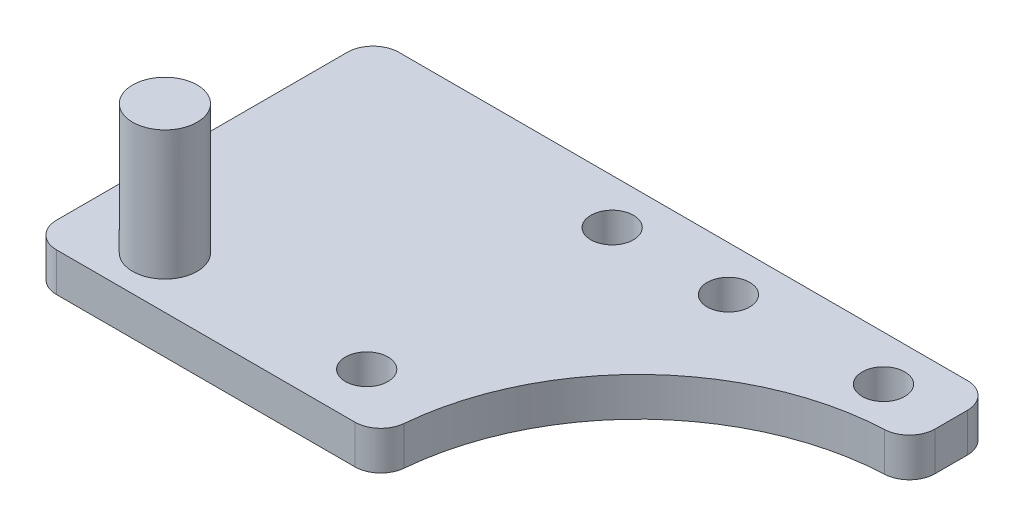
ISO-10303-21;
HEADER;
FILE_DESCRIPTION(('STEP AP214'),'2;1');
FILE_NAME('part.step','',(''),(''),'','','');
FILE_SCHEMA(('AUTOMOTIVE_DESIGN { 1 0 10303 214 1 1 1 1 }'));
ENDSEC;
DATA;
#1=APPLICATION_CONTEXT('core data for automotive mechanical design processes');
#2=APPLICATION_PROTOCOL_DEFINITION('international standard','automotive_design',2000,#1);
#3=PRODUCT_CONTEXT('',#1,'mechanical');
#4=PRODUCT('Part','Part','',(#3));
#5=PRODUCT_RELATED_PRODUCT_CATEGORY('part','',(#4));
#6=PRODUCT_DEFINITION_FORMATION('','',#4);
#7=PRODUCT_DEFINITION_CONTEXT('part definition',#1,'design');
#8=PRODUCT_DEFINITION('design','',#6,#7);
#9=PRODUCT_DEFINITION_SHAPE('','',#8);
#10=(LENGTH_UNIT() NAMED_UNIT(*) SI_UNIT(.MILLI.,.METRE.));
#11=(NAMED_UNIT(*) PLANE_ANGLE_UNIT() SI_UNIT($,.RADIAN.));
#12=(NAMED_UNIT(*) SI_UNIT($,.STERADIAN.) SOLID_ANGLE_UNIT());
#13=UNCERTAINTY_MEASURE_WITH_UNIT(LENGTH_MEASURE(1.E-05),#10,'distance_accuracy_value','');
#14=(GEOMETRIC_REPRESENTATION_CONTEXT(3) GLOBAL_UNCERTAINTY_ASSIGNED_CONTEXT((#13)) GLOBAL_UNIT_ASSIGNED_CONTEXT((#10,
#11,#12)) REPRESENTATION_CONTEXT('',''));
#15=CARTESIAN_POINT('',(0.,0.,0.));
#16=DIRECTION('',(0.,0.,1.));
#17=DIRECTION('',(1.,0.,0.));
#18=AXIS2_PLACEMENT_3D('',#15,#16,#17);
#19=CARTESIAN_POINT('',(55.9999843544523,3.,3.97498357217662));
#20=DIRECTION('',(0.,-1.,0.));
#21=DIRECTION('',(0.,0.,-1.));
#22=AXIS2_PLACEMENT_3D('',#19,#20,#21);
#23=PLANE('',#22);
#24=CARTESIAN_POINT('',(15.3807465805084,3.,0.));
#25=DIRECTION('',(0.,-1.,0.));
#26=DIRECTION('',(0.,0.,-1.));
#27=AXIS2_PLACEMENT_3D('',#24,#25,#26);
#28=CIRCLE('',#27,2.5);
#29=CARTESIAN_POINT('',(15.3807465805084,3.,-2.5));
#30=VERTEX_POINT('',#29);
#31=EDGE_CURVE('E152',#30,#30,#28,.F.);
#32=ORIENTED_EDGE('',*,*,#31,.F.);
#33=EDGE_LOOP('',(#32));
#34=FACE_BOUND('',#33,.T.);
#35=DIRECTION('',(0.,0.,-1.));
#36=VECTOR('',#35,1.);
#37=CARTESIAN_POINT('',(57.,3.,-20.9999999999984));
#38=LINE('',#37,#36);
#39=CARTESIAN_POINT('',(57.,3.,-18.0022781155508));
#40=VERTEX_POINT('',#39);
#41=CARTESIAN_POINT('',(57.,3.,-20.4937058414741));
#42=VERTEX_POINT('',#41);
#43=EDGE_CURVE('E155',#40,#42,#38,.T.);
#44=ORIENTED_EDGE('',*,*,#43,.T.);
#45=CARTESIAN_POINT('',(55.,3.,-20.4937058414741));
#46=DIRECTION('',(0.,-1.,0.));
#47=DIRECTION('',(0.,0.,-1.));
#48=AXIS2_PLACEMENT_3D('',#45,#46,#47);
#49=CIRCLE('',#48,2.);
#50=CARTESIAN_POINT('',(55.,3.,-22.4937058414741));
#51=VERTEX_POINT('',#50);
#52=EDGE_CURVE('E173',#42,#51,#49,.F.);
#53=ORIENTED_EDGE('',*,*,#52,.T.);
#54=DIRECTION('',(-1.,0.,0.));
#55=VECTOR('',#54,1.);
#56=CARTESIAN_POINT('',(8.99999999999998,3.,-22.4937058414741));
#57=LINE('',#56,#55);
#58=CARTESIAN_POINT('',(11.,3.,-22.4937058414741));
#59=VERTEX_POINT('',#58);
#60=EDGE_CURVE('E137',#51,#59,#57,.T.);
#61=ORIENTED_EDGE('',*,*,#60,.T.);
#62=CARTESIAN_POINT('',(11.,3.,-20.4937058414741));
#63=DIRECTION('',(0.,-1.,0.));
#64=DIRECTION('',(0.,0.,-1.));
#65=AXIS2_PLACEMENT_3D('',#62,#63,#64);
#66=CIRCLE('',#65,2.);
#67=CARTESIAN_POINT('',(8.99999999999998,3.,-20.4937058414741));
#68=VERTEX_POINT('',#67);
#69=EDGE_CURVE('E166',#59,#68,#66,.F.);
#70=ORIENTED_EDGE('',*,*,#69,.T.);
#71=DIRECTION('',(0.,0.,1.));
#72=VECTOR('',#71,1.);
#73=CARTESIAN_POINT('',(8.99999999999998,3.,4.));
#74=LINE('',#73,#72);
#75=CARTESIAN_POINT('',(8.99999999999998,3.,2.));
#76=VERTEX_POINT('',#75);
#77=EDGE_CURVE('E146',#68,#76,#74,.T.);
#78=ORIENTED_EDGE('',*,*,#77,.T.);
#79=CARTESIAN_POINT('',(11.,3.,2.));
#80=DIRECTION('',(0.,-1.,0.));
#81=DIRECTION('',(0.,0.,-1.));
#82=AXIS2_PLACEMENT_3D('',#79,#80,#81);
#83=CIRCLE('',#82,2.);
#84=CARTESIAN_POINT('',(11.,3.,4.));
#85=VERTEX_POINT('',#84);
#86=EDGE_CURVE('E168',#76,#85,#83,.F.);
#87=ORIENTED_EDGE('',*,*,#86,.T.);
#88=DIRECTION('',(1.,0.,0.));
#89=VECTOR('',#88,1.);
#90=CARTESIAN_POINT('',(8.99999999999998,3.,4.));
#91=LINE('',#90,#89);
#92=CARTESIAN_POINT('',(34.088812777158,3.,4.));
#93=VERTEX_POINT('',#92);
#94=EDGE_CURVE('E218',#85,#93,#91,.T.);
#95=ORIENTED_EDGE('',*,*,#94,.T.);
#96=CARTESIAN_POINT('',(34.088812777158,3.,2.));
#97=DIRECTION('',(0.,-1.,0.));
#98=DIRECTION('',(0.,0.,-1.));
#99=AXIS2_PLACEMENT_3D('',#96,#97,#98);
#100=CIRCLE('',#99,2.);
#101=CARTESIAN_POINT('',(36.0807374660029,3.,2.17954396110697));
#102=VERTEX_POINT('',#101);
#103=EDGE_CURVE('E61',#93,#102,#100,.F.);
#104=ORIENTED_EDGE('',*,*,#103,.T.);
#105=CARTESIAN_POINT('',(55.9999843544523,3.,3.97498357217662));
#106=DIRECTION('',(0.,-1.,0.));
#107=DIRECTION('',(0.,0.,-1.));
#108=AXIS2_PLACEMENT_3D('',#105,#106,#107);
#109=CIRCLE('',#108,20.);
#110=CARTESIAN_POINT('',(55.0909076685865,3.,-16.0043452348483));
#111=VERTEX_POINT('',#110);
#112=EDGE_CURVE('E215',#102,#111,#109,.T.);
#113=ORIENTED_EDGE('',*,*,#112,.T.);
#114=CARTESIAN_POINT('',(55.,3.,-18.0022781155508));
#115=DIRECTION('',(0.,-1.,0.));
#116=DIRECTION('',(0.,0.,-1.));
#117=AXIS2_PLACEMENT_3D('',#114,#115,#116);
#118=CIRCLE('',#117,2.);
#119=EDGE_CURVE('E171',#111,#40,#118,.F.);
#120=ORIENTED_EDGE('',*,*,#119,.T.);
#121=EDGE_LOOP('',(#44,#53,#61,#70,#78,#87,#95,#104,#113,#120));
#122=FACE_BOUND('',#121,.T.);
#123=CARTESIAN_POINT('',(31.,3.,-19.));
#124=DIRECTION('',(0.,1.,0.));
#125=DIRECTION('',(0.,0.,1.));
#126=AXIS2_PLACEMENT_3D('',#123,#124,#125);
#127=CIRCLE('',#126,1.65);
#128=CARTESIAN_POINT('',(31.,3.,-17.35));
#129=VERTEX_POINT('',#128);
#130=EDGE_CURVE('E196',#129,#129,#127,.T.);
#131=ORIENTED_EDGE('',*,*,#130,.F.);
#132=EDGE_LOOP('',(#131));
#133=FACE_BOUND('',#132,.T.);
#134=CARTESIAN_POINT('',(40.,3.,-19.));
#135=DIRECTION('',(0.,1.,0.));
#136=DIRECTION('',(0.,0.,1.));
#137=AXIS2_PLACEMENT_3D('',#134,#135,#136);
#138=CIRCLE('',#137,1.65);
#139=CARTESIAN_POINT('',(40.,3.,-17.35));
#140=VERTEX_POINT('',#139);
#141=EDGE_CURVE('E223',#140,#140,#138,.T.);
#142=ORIENTED_EDGE('',*,*,#141,.F.);
#143=EDGE_LOOP('',(#142));
#144=FACE_BOUND('',#143,.T.);
#145=CARTESIAN_POINT('',(52.,3.,-19.));
#146=DIRECTION('',(0.,1.,0.));
#147=DIRECTION('',(0.,0.,1.));
#148=AXIS2_PLACEMENT_3D('',#145,#146,#147);
#149=CIRCLE('',#148,1.65);
#150=CARTESIAN_POINT('',(52.,3.,-17.35));
#151=VERTEX_POINT('',#150);
#152=EDGE_CURVE('E228',#151,#151,#149,.T.);
#153=ORIENTED_EDGE('',*,*,#152,.F.);
#154=EDGE_LOOP('',(#153));
#155=FACE_BOUND('',#154,.T.);
#156=CARTESIAN_POINT('',(31.,3.,0.));
#157=DIRECTION('',(0.,1.,0.));
#158=DIRECTION('',(0.,0.,1.));
#159=AXIS2_PLACEMENT_3D('',#156,#157,#158);
#160=CIRCLE('',#159,1.65);
#161=CARTESIAN_POINT('',(31.,3.,1.65));
#162=VERTEX_POINT('',#161);
#163=EDGE_CURVE('E234',#162,#162,#160,.T.);
#164=ORIENTED_EDGE('',*,*,#163,.F.);
#165=EDGE_LOOP('',(#164));
#166=FACE_BOUND('',#165,.T.);
#167=ADVANCED_FACE('F39',(#34,#122,#133,#144,#155,#166),#23,.F.);
#168=CARTESIAN_POINT('',(55.9999843544523,0.,3.97498357217662));
#169=DIRECTION('',(0.,-1.,0.));
#170=DIRECTION('',(0.,0.,-1.));
#171=AXIS2_PLACEMENT_3D('',#168,#169,#170);
#172=PLANE('',#171);
#173=CARTESIAN_POINT('',(52.,0.,-19.));
#174=DIRECTION('',(0.,1.,0.));
#175=DIRECTION('',(0.,0.,1.));
#176=AXIS2_PLACEMENT_3D('',#173,#174,#175);
#177=CIRCLE('',#176,1.65);
#178=CARTESIAN_POINT('',(52.,0.,-17.35));
#179=VERTEX_POINT('',#178);
#180=EDGE_CURVE('E231',#179,#179,#177,.T.);
#181=ORIENTED_EDGE('',*,*,#180,.T.);
#182=EDGE_LOOP('',(#181));
#183=FACE_BOUND('',#182,.T.);
#184=CARTESIAN_POINT('',(31.,0.,-19.));
#185=DIRECTION('',(0.,1.,0.));
#186=DIRECTION('',(0.,0.,1.));
#187=AXIS2_PLACEMENT_3D('',#184,#185,#186);
#188=CIRCLE('',#187,1.65);
#189=CARTESIAN_POINT('',(31.,0.,-17.35));
#190=VERTEX_POINT('',#189);
#191=EDGE_CURVE('E201',#190,#190,#188,.T.);
#192=ORIENTED_EDGE('',*,*,#191,.T.);
#193=EDGE_LOOP('',(#192));
#194=FACE_BOUND('',#193,.T.);
#195=DIRECTION('',(-1.,0.,0.));
#196=VECTOR('',#195,1.);
#197=CARTESIAN_POINT('',(21.,0.,-22.4937058414741));
#198=LINE('',#197,#196);
#199=CARTESIAN_POINT('',(55.,0.,-22.4937058414741));
#200=VERTEX_POINT('',#199);
#201=CARTESIAN_POINT('',(11.,0.,-22.4937058414741));
#202=VERTEX_POINT('',#201);
#203=EDGE_CURVE('E134',#200,#202,#198,.T.);
#204=ORIENTED_EDGE('',*,*,#203,.F.);
#205=CARTESIAN_POINT('',(55.,0.,-20.4937058414741));
#206=DIRECTION('',(0.,-1.,0.));
#207=DIRECTION('',(0.,0.,-1.));
#208=AXIS2_PLACEMENT_3D('',#205,#206,#207);
#209=CIRCLE('',#208,2.);
#210=CARTESIAN_POINT('',(57.,0.,-20.4937058414741));
#211=VERTEX_POINT('',#210);
#212=EDGE_CURVE('E117',#200,#211,#209,.T.);
#213=ORIENTED_EDGE('',*,*,#212,.T.);
#214=DIRECTION('',(0.,0.,-1.));
#215=VECTOR('',#214,1.);
#216=CARTESIAN_POINT('',(57.,0.,-22.4937058414741));
#217=LINE('',#216,#215);
#218=CARTESIAN_POINT('',(57.,0.,-18.0022781155508));
#219=VERTEX_POINT('',#218);
#220=EDGE_CURVE('E144',#219,#211,#217,.T.);
#221=ORIENTED_EDGE('',*,*,#220,.F.);
#222=CARTESIAN_POINT('',(55.,0.,-18.0022781155508));
#223=DIRECTION('',(0.,-1.,0.));
#224=DIRECTION('',(0.,0.,-1.));
#225=AXIS2_PLACEMENT_3D('',#222,#223,#224);
#226=CIRCLE('',#225,2.);
#227=CARTESIAN_POINT('',(55.0909076685865,0.,-16.0043452348483));
#228=VERTEX_POINT('',#227);
#229=EDGE_CURVE('E128',#219,#228,#226,.T.);
#230=ORIENTED_EDGE('',*,*,#229,.T.);
#231=CARTESIAN_POINT('',(55.9999843544523,0.,3.97498357217662));
#232=DIRECTION('',(0.,-1.,0.));
#233=DIRECTION('',(0.,0.,-1.));
#234=AXIS2_PLACEMENT_3D('',#231,#232,#233);
#235=CIRCLE('',#234,20.);
#236=CARTESIAN_POINT('',(36.0807374660029,0.,2.17954396110697));
#237=VERTEX_POINT('',#236);
#238=EDGE_CURVE('E148',#237,#228,#235,.T.);
#239=ORIENTED_EDGE('',*,*,#238,.F.);
#240=CARTESIAN_POINT('',(34.088812777158,0.,2.));
#241=DIRECTION('',(0.,-1.,0.));
#242=DIRECTION('',(0.,0.,-1.));
#243=AXIS2_PLACEMENT_3D('',#240,#241,#242);
#244=CIRCLE('',#243,2.);
#245=CARTESIAN_POINT('',(34.088812777158,0.,4.));
#246=VERTEX_POINT('',#245);
#247=EDGE_CURVE('E160',#237,#246,#244,.T.);
#248=ORIENTED_EDGE('',*,*,#247,.T.);
#249=DIRECTION('',(1.,0.,0.));
#250=VECTOR('',#249,1.);
#251=CARTESIAN_POINT('',(8.99999999999998,0.,4.));
#252=LINE('',#251,#250);
#253=CARTESIAN_POINT('',(11.,0.,4.));
#254=VERTEX_POINT('',#253);
#255=EDGE_CURVE('E195',#254,#246,#252,.T.);
#256=ORIENTED_EDGE('',*,*,#255,.F.);
#257=CARTESIAN_POINT('',(11.,0.,2.));
#258=DIRECTION('',(0.,-1.,0.));
#259=DIRECTION('',(0.,0.,-1.));
#260=AXIS2_PLACEMENT_3D('',#257,#258,#259);
#261=CIRCLE('',#260,2.);
#262=CARTESIAN_POINT('',(8.99999999999998,0.,2.));
#263=VERTEX_POINT('',#262);
#264=EDGE_CURVE('E158',#254,#263,#261,.T.);
#265=ORIENTED_EDGE('',*,*,#264,.T.);
#266=DIRECTION('',(0.,0.,1.));
#267=VECTOR('',#266,1.);
#268=CARTESIAN_POINT('',(8.99999999999998,0.,4.));
#269=LINE('',#268,#267);
#270=CARTESIAN_POINT('',(8.99999999999998,0.,-20.4937058414741));
#271=VERTEX_POINT('',#270);
#272=EDGE_CURVE('E189',#271,#263,#269,.T.);
#273=ORIENTED_EDGE('',*,*,#272,.F.);
#274=CARTESIAN_POINT('',(11.,0.,-20.4937058414741));
#275=DIRECTION('',(0.,-1.,0.));
#276=DIRECTION('',(0.,0.,-1.));
#277=AXIS2_PLACEMENT_3D('',#274,#275,#276);
#278=CIRCLE('',#277,2.);
#279=EDGE_CURVE('E138',#271,#202,#278,.T.);
#280=ORIENTED_EDGE('',*,*,#279,.T.);
#281=EDGE_LOOP('',(#204,#213,#221,#230,#239,#248,#256,#265,#273,#280));
#282=FACE_BOUND('',#281,.T.);
#283=CARTESIAN_POINT('',(40.,0.,-19.));
#284=DIRECTION('',(0.,1.,0.));
#285=DIRECTION('',(0.,0.,1.));
#286=AXIS2_PLACEMENT_3D('',#283,#284,#285);
#287=CIRCLE('',#286,1.65);
#288=CARTESIAN_POINT('',(40.,0.,-17.35));
#289=VERTEX_POINT('',#288);
#290=EDGE_CURVE('E225',#289,#289,#287,.T.);
#291=ORIENTED_EDGE('',*,*,#290,.T.);
#292=EDGE_LOOP('',(#291));
#293=FACE_BOUND('',#292,.T.);
#294=CARTESIAN_POINT('',(31.,0.,0.));
#295=DIRECTION('',(0.,1.,0.));
#296=DIRECTION('',(0.,0.,1.));
#297=AXIS2_PLACEMENT_3D('',#294,#295,#296);
#298=CIRCLE('',#297,1.65);
#299=CARTESIAN_POINT('',(31.,0.,1.65));
#300=VERTEX_POINT('',#299);
#301=EDGE_CURVE('E237',#300,#300,#298,.T.);
#302=ORIENTED_EDGE('',*,*,#301,.T.);
#303=EDGE_LOOP('',(#302));
#304=FACE_BOUND('',#303,.T.);
#305=ADVANCED_FACE('F141',(#183,#194,#282,#293,#304),#172,.T.);
#306=CARTESIAN_POINT('',(8.99999999999998,3.,4.));
#307=DIRECTION('',(1.,0.,0.));
#308=DIRECTION('',(0.,0.,-1.));
#309=AXIS2_PLACEMENT_3D('',#306,#307,#308);
#310=PLANE('',#309);
#311=ORIENTED_EDGE('',*,*,#272,.T.);
#312=DIRECTION('',(0.,-1.,0.));
#313=VECTOR('',#312,1.);
#314=CARTESIAN_POINT('',(8.99999999999998,3.,2.));
#315=LINE('',#314,#313);
#316=EDGE_CURVE('E11',#263,#76,#315,.F.);
#317=ORIENTED_EDGE('',*,*,#316,.T.);
#318=ORIENTED_EDGE('',*,*,#77,.F.);
#319=DIRECTION('',(0.,-1.,0.));
#320=VECTOR('',#319,1.);
#321=CARTESIAN_POINT('',(8.99999999999998,3.,-20.4937058414741));
#322=LINE('',#321,#320);
#323=EDGE_CURVE('E47',#68,#271,#322,.T.);
#324=ORIENTED_EDGE('',*,*,#323,.T.);
#325=EDGE_LOOP('',(#311,#317,#318,#324));
#326=FACE_BOUND('',#325,.T.);
#327=ADVANCED_FACE('F188',(#326),#310,.F.);
#328=CARTESIAN_POINT('',(8.99999999999998,3.,4.));
#329=DIRECTION('',(0.,0.,-1.));
#330=DIRECTION('',(-1.,0.,0.));
#331=AXIS2_PLACEMENT_3D('',#328,#329,#330);
#332=PLANE('',#331);
#333=ORIENTED_EDGE('',*,*,#255,.T.);
#334=DIRECTION('',(0.,-1.,0.));
#335=VECTOR('',#334,1.);
#336=CARTESIAN_POINT('',(34.088812777158,3.,4.));
#337=LINE('',#336,#335);
#338=EDGE_CURVE('E182',#246,#93,#337,.F.);
#339=ORIENTED_EDGE('',*,*,#338,.T.);
#340=ORIENTED_EDGE('',*,*,#94,.F.);
#341=DIRECTION('',(0.,-1.,0.));
#342=VECTOR('',#341,1.);
#343=CARTESIAN_POINT('',(11.,3.,4.));
#344=LINE('',#343,#342);
#345=EDGE_CURVE('E179',#85,#254,#344,.T.);
#346=ORIENTED_EDGE('',*,*,#345,.T.);
#347=EDGE_LOOP('',(#333,#339,#340,#346));
#348=FACE_BOUND('',#347,.T.);
#349=ADVANCED_FACE('F273',(#348),#332,.F.);
#350=CARTESIAN_POINT('',(55.9999843544523,3.,3.97498357217662));
#351=DIRECTION('',(0.,-1.,0.));
#352=DIRECTION('',(0.,0.,-1.));
#353=AXIS2_PLACEMENT_3D('',#350,#351,#352);
#354=CYLINDRICAL_SURFACE('',#353,20.);
#355=ORIENTED_EDGE('',*,*,#238,.T.);
#356=DIRECTION('',(0.,-1.,0.));
#357=VECTOR('',#356,1.);
#358=CARTESIAN_POINT('',(55.0909076685865,3.,-16.0043452348483));
#359=LINE('',#358,#357);
#360=EDGE_CURVE('E54',#228,#111,#359,.F.);
#361=ORIENTED_EDGE('',*,*,#360,.T.);
#362=ORIENTED_EDGE('',*,*,#112,.F.);
#363=DIRECTION('',(0.,-1.,0.));
#364=VECTOR('',#363,1.);
#365=CARTESIAN_POINT('',(36.0807374660029,3.,2.17954396110697));
#366=LINE('',#365,#364);
#367=EDGE_CURVE('E175',#102,#237,#366,.T.);
#368=ORIENTED_EDGE('',*,*,#367,.T.);
#369=EDGE_LOOP('',(#355,#361,#362,#368));
#370=FACE_BOUND('',#369,.T.);
#371=ADVANCED_FACE('F206',(#370),#354,.F.);
#372=CARTESIAN_POINT('',(57.,3.,-22.4937058414741));
#373=DIRECTION('',(-1.,0.,0.));
#374=DIRECTION('',(0.,0.,1.));
#375=AXIS2_PLACEMENT_3D('',#372,#373,#374);
#376=PLANE('',#375);
#377=ORIENTED_EDGE('',*,*,#220,.T.);
#378=DIRECTION('',(0.,-1.,0.));
#379=VECTOR('',#378,1.);
#380=CARTESIAN_POINT('',(57.,3.,-20.4937058414741));
#381=LINE('',#380,#379);
#382=EDGE_CURVE('E122',#211,#42,#381,.F.);
#383=ORIENTED_EDGE('',*,*,#382,.T.);
#384=ORIENTED_EDGE('',*,*,#43,.F.);
#385=DIRECTION('',(0.,-1.,0.));
#386=VECTOR('',#385,1.);
#387=CARTESIAN_POINT('',(57.,3.,-18.0022781155508));
#388=LINE('',#387,#386);
#389=EDGE_CURVE('E127',#40,#219,#388,.T.);
#390=ORIENTED_EDGE('',*,*,#389,.T.);
#391=EDGE_LOOP('',(#377,#383,#384,#390));
#392=FACE_BOUND('',#391,.T.);
#393=ADVANCED_FACE('F217',(#392),#376,.F.);
#394=CARTESIAN_POINT('',(21.,3.,-22.4937058414741));
#395=DIRECTION('',(0.,0.,1.));
#396=DIRECTION('',(1.,0.,0.));
#397=AXIS2_PLACEMENT_3D('',#394,#395,#396);
#398=PLANE('',#397);
#399=ORIENTED_EDGE('',*,*,#60,.F.);
#400=DIRECTION('',(0.,-1.,0.));
#401=VECTOR('',#400,1.);
#402=CARTESIAN_POINT('',(55.,3.,-22.4937058414741));
#403=LINE('',#402,#401);
#404=EDGE_CURVE('E121',#51,#200,#403,.T.);
#405=ORIENTED_EDGE('',*,*,#404,.T.);
#406=ORIENTED_EDGE('',*,*,#203,.T.);
#407=DIRECTION('',(0.,-1.,0.));
#408=VECTOR('',#407,1.);
#409=CARTESIAN_POINT('',(11.,3.,-22.4937058414741));
#410=LINE('',#409,#408);
#411=EDGE_CURVE('E139',#202,#59,#410,.F.);
#412=ORIENTED_EDGE('',*,*,#411,.T.);
#413=EDGE_LOOP('',(#399,#405,#406,#412));
#414=FACE_BOUND('',#413,.T.);
#415=ADVANCED_FACE('F133',(#414),#398,.F.);
#416=CARTESIAN_POINT('',(31.,3.,-19.));
#417=DIRECTION('',(0.,-1.,0.));
#418=DIRECTION('',(0.,0.,-1.));
#419=AXIS2_PLACEMENT_3D('',#416,#417,#418);
#420=CYLINDRICAL_SURFACE('',#419,1.65);
#421=ORIENTED_EDGE('',*,*,#130,.T.);
#422=EDGE_LOOP('',(#421));
#423=FACE_BOUND('',#422,.T.);
#424=ORIENTED_EDGE('',*,*,#191,.F.);
#425=EDGE_LOOP('',(#424));
#426=FACE_BOUND('',#425,.T.);
#427=ADVANCED_FACE('F264',(#423,#426),#420,.F.);
#428=CARTESIAN_POINT('',(40.,3.,-19.));
#429=DIRECTION('',(0.,-1.,0.));
#430=DIRECTION('',(0.,0.,-1.));
#431=AXIS2_PLACEMENT_3D('',#428,#429,#430);
#432=CYLINDRICAL_SURFACE('',#431,1.65);
#433=ORIENTED_EDGE('',*,*,#141,.T.);
#434=EDGE_LOOP('',(#433));
#435=FACE_BOUND('',#434,.T.);
#436=ORIENTED_EDGE('',*,*,#290,.F.);
#437=EDGE_LOOP('',(#436));
#438=FACE_BOUND('',#437,.T.);
#439=ADVANCED_FACE('F353',(#435,#438),#432,.F.);
#440=CARTESIAN_POINT('',(52.,3.,-19.));
#441=DIRECTION('',(0.,-1.,0.));
#442=DIRECTION('',(0.,0.,-1.));
#443=AXIS2_PLACEMENT_3D('',#440,#441,#442);
#444=CYLINDRICAL_SURFACE('',#443,1.65);
#445=ORIENTED_EDGE('',*,*,#152,.T.);
#446=EDGE_LOOP('',(#445));
#447=FACE_BOUND('',#446,.T.);
#448=ORIENTED_EDGE('',*,*,#180,.F.);
#449=EDGE_LOOP('',(#448));
#450=FACE_BOUND('',#449,.T.);
#451=ADVANCED_FACE('F343',(#447,#450),#444,.F.);
#452=CARTESIAN_POINT('',(31.,3.,0.));
#453=DIRECTION('',(0.,-1.,0.));
#454=DIRECTION('',(0.,0.,-1.));
#455=AXIS2_PLACEMENT_3D('',#452,#453,#454);
#456=CYLINDRICAL_SURFACE('',#455,1.65);
#457=ORIENTED_EDGE('',*,*,#163,.T.);
#458=EDGE_LOOP('',(#457));
#459=FACE_BOUND('',#458,.T.);
#460=ORIENTED_EDGE('',*,*,#301,.F.);
#461=EDGE_LOOP('',(#460));
#462=FACE_BOUND('',#461,.T.);
#463=ADVANCED_FACE('F251',(#459,#462),#456,.F.);
#464=CARTESIAN_POINT('',(15.3807465805084,13.,0.));
#465=DIRECTION('',(0.,-1.,0.));
#466=DIRECTION('',(0.,0.,-1.));
#467=AXIS2_PLACEMENT_3D('',#464,#465,#466);
#468=CYLINDRICAL_SURFACE('',#467,2.5);
#469=CARTESIAN_POINT('',(15.3807465805084,13.,0.));
#470=DIRECTION('',(0.,1.,0.));
#471=DIRECTION('',(0.,0.,1.));
#472=AXIS2_PLACEMENT_3D('',#469,#470,#471);
#473=CIRCLE('',#472,2.5);
#474=CARTESIAN_POINT('',(15.3807465805084,13.,2.5));
#475=VERTEX_POINT('',#474);
#476=EDGE_CURVE('E240',#475,#475,#473,.T.);
#477=ORIENTED_EDGE('',*,*,#476,.F.);
#478=EDGE_LOOP('',(#477));
#479=FACE_BOUND('',#478,.T.);
#480=ORIENTED_EDGE('',*,*,#31,.T.);
#481=EDGE_LOOP('',(#480));
#482=FACE_BOUND('',#481,.T.);
#483=ADVANCED_FACE('F248',(#479,#482),#468,.T.);
#484=CARTESIAN_POINT('',(15.3807465805084,13.,0.));
#485=DIRECTION('',(0.,1.,0.));
#486=DIRECTION('',(0.,0.,1.));
#487=AXIS2_PLACEMENT_3D('',#484,#485,#486);
#488=PLANE('',#487);
#489=ORIENTED_EDGE('',*,*,#476,.T.);
#490=EDGE_LOOP('',(#489));
#491=FACE_BOUND('',#490,.T.);
#492=ADVANCED_FACE('F246',(#491),#488,.T.);
#493=CARTESIAN_POINT('',(55.,3.,-20.4937058414741));
#494=DIRECTION('',(0.,-1.,0.));
#495=DIRECTION('',(0.,0.,-1.));
#496=AXIS2_PLACEMENT_3D('',#493,#494,#495);
#497=CYLINDRICAL_SURFACE('',#496,2.);
#498=ORIENTED_EDGE('',*,*,#52,.F.);
#499=ORIENTED_EDGE('',*,*,#382,.F.);
#500=ORIENTED_EDGE('',*,*,#212,.F.);
#501=ORIENTED_EDGE('',*,*,#404,.F.);
#502=EDGE_LOOP('',(#498,#499,#500,#501));
#503=FACE_BOUND('',#502,.T.);
#504=ADVANCED_FACE('F120',(#503),#497,.T.);
#505=CARTESIAN_POINT('',(55.,3.,-18.0022781155508));
#506=DIRECTION('',(0.,-1.,0.));
#507=DIRECTION('',(0.,0.,-1.));
#508=AXIS2_PLACEMENT_3D('',#505,#506,#507);
#509=CYLINDRICAL_SURFACE('',#508,2.);
#510=ORIENTED_EDGE('',*,*,#119,.F.);
#511=ORIENTED_EDGE('',*,*,#360,.F.);
#512=ORIENTED_EDGE('',*,*,#229,.F.);
#513=ORIENTED_EDGE('',*,*,#389,.F.);
#514=EDGE_LOOP('',(#510,#511,#512,#513));
#515=FACE_BOUND('',#514,.T.);
#516=ADVANCED_FACE('F210',(#515),#509,.T.);
#517=CARTESIAN_POINT('',(34.088812777158,3.,2.));
#518=DIRECTION('',(0.,-1.,0.));
#519=DIRECTION('',(0.,0.,-1.));
#520=AXIS2_PLACEMENT_3D('',#517,#518,#519);
#521=CYLINDRICAL_SURFACE('',#520,2.);
#522=ORIENTED_EDGE('',*,*,#103,.F.);
#523=ORIENTED_EDGE('',*,*,#338,.F.);
#524=ORIENTED_EDGE('',*,*,#247,.F.);
#525=ORIENTED_EDGE('',*,*,#367,.F.);
#526=EDGE_LOOP('',(#522,#523,#524,#525));
#527=FACE_BOUND('',#526,.T.);
#528=ADVANCED_FACE('F283',(#527),#521,.T.);
#529=CARTESIAN_POINT('',(11.,3.,2.));
#530=DIRECTION('',(0.,-1.,0.));
#531=DIRECTION('',(0.,0.,-1.));
#532=AXIS2_PLACEMENT_3D('',#529,#530,#531);
#533=CYLINDRICAL_SURFACE('',#532,2.);
#534=ORIENTED_EDGE('',*,*,#86,.F.);
#535=ORIENTED_EDGE('',*,*,#316,.F.);
#536=ORIENTED_EDGE('',*,*,#264,.F.);
#537=ORIENTED_EDGE('',*,*,#345,.F.);
#538=EDGE_LOOP('',(#534,#535,#536,#537));
#539=FACE_BOUND('',#538,.T.);
#540=ADVANCED_FACE('F285',(#539),#533,.T.);
#541=CARTESIAN_POINT('',(11.,3.,-20.4937058414741));
#542=DIRECTION('',(0.,-1.,0.));
#543=DIRECTION('',(0.,0.,-1.));
#544=AXIS2_PLACEMENT_3D('',#541,#542,#543);
#545=CYLINDRICAL_SURFACE('',#544,2.);
#546=ORIENTED_EDGE('',*,*,#69,.F.);
#547=ORIENTED_EDGE('',*,*,#411,.F.);
#548=ORIENTED_EDGE('',*,*,#279,.F.);
#549=ORIENTED_EDGE('',*,*,#323,.F.);
#550=EDGE_LOOP('',(#546,#547,#548,#549));
#551=FACE_BOUND('',#550,.T.);
#552=ADVANCED_FACE('F41',(#551),#545,.T.);
#553=CLOSED_SHELL('',(#167,#305,#327,#349,#371,#393,#415,#427,#439,#451,#463,#483,#492,#504,
#516,#528,#540,#552));
#554=MANIFOLD_SOLID_BREP('B2',#553);
#555=ADVANCED_BREP_SHAPE_REPRESENTATION('',(#18,#554),#14);
#556=SHAPE_DEFINITION_REPRESENTATION(#9,#555);
ENDSEC;
END-ISO-10303-21;
